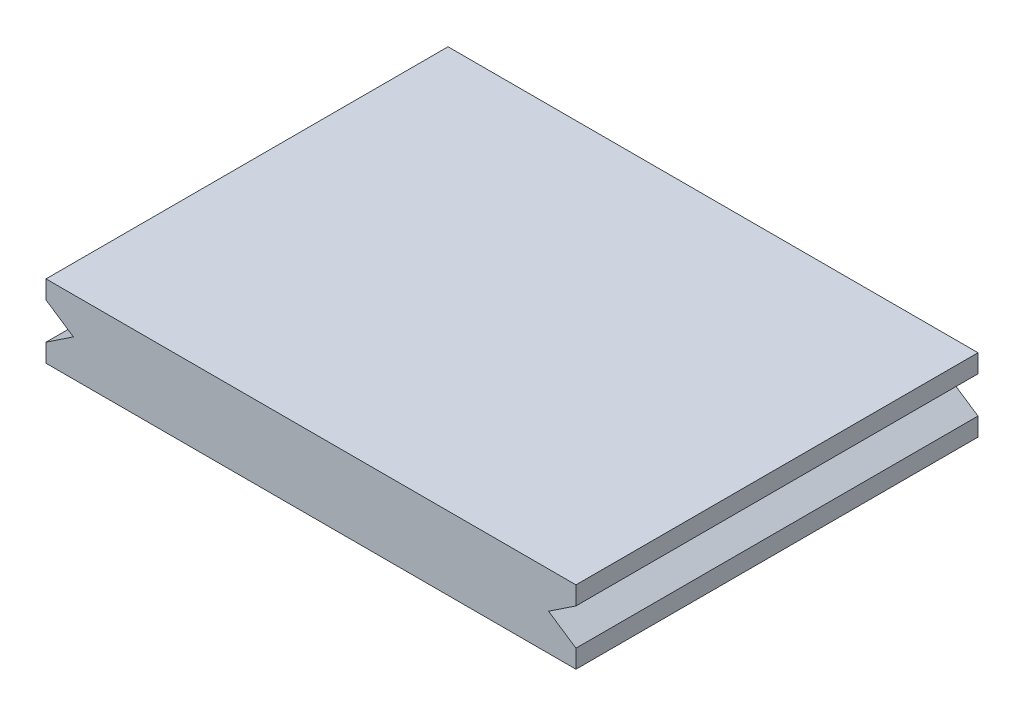
ISO-10303-21;
HEADER;
FILE_DESCRIPTION(('STEP AP214'),'2;1');
FILE_NAME('part.step','',(''),(''),'','','');
FILE_SCHEMA(('AUTOMOTIVE_DESIGN { 1 0 10303 214 1 1 1 1 }'));
ENDSEC;
DATA;
#1=APPLICATION_CONTEXT('core data for automotive mechanical design processes');
#2=APPLICATION_PROTOCOL_DEFINITION('international standard','automotive_design',2000,#1);
#3=PRODUCT_CONTEXT('',#1,'mechanical');
#4=PRODUCT('Part','Part','',(#3));
#5=PRODUCT_RELATED_PRODUCT_CATEGORY('part','',(#4));
#6=PRODUCT_DEFINITION_FORMATION('','',#4);
#7=PRODUCT_DEFINITION_CONTEXT('part definition',#1,'design');
#8=PRODUCT_DEFINITION('design','',#6,#7);
#9=PRODUCT_DEFINITION_SHAPE('','',#8);
#10=(LENGTH_UNIT() NAMED_UNIT(*) SI_UNIT(.MILLI.,.METRE.));
#11=(NAMED_UNIT(*) PLANE_ANGLE_UNIT() SI_UNIT($,.RADIAN.));
#12=(NAMED_UNIT(*) SI_UNIT($,.STERADIAN.) SOLID_ANGLE_UNIT());
#13=UNCERTAINTY_MEASURE_WITH_UNIT(LENGTH_MEASURE(1.E-05),#10,'distance_accuracy_value','');
#14=(GEOMETRIC_REPRESENTATION_CONTEXT(3) GLOBAL_UNCERTAINTY_ASSIGNED_CONTEXT((#13)) GLOBAL_UNIT_ASSIGNED_CONTEXT((#10,
#11,#12)) REPRESENTATION_CONTEXT('',''));
#15=CARTESIAN_POINT('',(0.,0.,0.));
#16=DIRECTION('',(0.,0.,1.));
#17=DIRECTION('',(1.,0.,0.));
#18=AXIS2_PLACEMENT_3D('',#15,#16,#17);
#19=CARTESIAN_POINT('',(11.6,0.,17.6));
#20=DIRECTION('',(1.,0.,0.));
#21=DIRECTION('',(0.,0.,-1.));
#22=AXIS2_PLACEMENT_3D('',#19,#20,#21);
#23=PLANE('',#22);
#24=DIRECTION('',(0.,-1.,0.));
#25=VECTOR('',#24,1.);
#26=CARTESIAN_POINT('',(11.6,0.,0.));
#27=LINE('',#26,#25);
#28=CARTESIAN_POINT('',(11.6,-0.799999999999979,0.));
#29=VERTEX_POINT('',#28);
#30=CARTESIAN_POINT('',(11.6,-1.6,0.));
#31=VERTEX_POINT('',#30);
#32=EDGE_CURVE('E139',#29,#31,#27,.T.);
#33=ORIENTED_EDGE('',*,*,#32,.F.);
#34=DIRECTION('',(0.,0.,-1.));
#35=VECTOR('',#34,1.);
#36=CARTESIAN_POINT('',(11.6,-0.799999999999979,17.6));
#37=LINE('',#36,#35);
#38=CARTESIAN_POINT('',(11.6,-0.799999999999979,17.6));
#39=VERTEX_POINT('',#38);
#40=EDGE_CURVE('E11',#39,#29,#37,.T.);
#41=ORIENTED_EDGE('',*,*,#40,.F.);
#42=DIRECTION('',(0.,-1.,0.));
#43=VECTOR('',#42,1.);
#44=CARTESIAN_POINT('',(11.6,0.,17.6));
#45=LINE('',#44,#43);
#46=CARTESIAN_POINT('',(11.6,-1.6,17.6));
#47=VERTEX_POINT('',#46);
#48=EDGE_CURVE('E160',#39,#47,#45,.T.);
#49=ORIENTED_EDGE('',*,*,#48,.T.);
#50=DIRECTION('',(0.,0.,-1.));
#51=VECTOR('',#50,1.);
#52=CARTESIAN_POINT('',(11.6,-1.6,17.6));
#53=LINE('',#52,#51);
#54=EDGE_CURVE('E90',#47,#31,#53,.T.);
#55=ORIENTED_EDGE('',*,*,#54,.T.);
#56=EDGE_LOOP('',(#33,#41,#49,#55));
#57=FACE_BOUND('',#56,.T.);
#58=ADVANCED_FACE('F33',(#57),#23,.T.);
#59=CARTESIAN_POINT('',(3.2,4.80000000000001,17.6));
#60=DIRECTION('',(-0.554700196225228,-0.832050294337844,0.));
#61=DIRECTION('',(0.832050294337844,-0.554700196225228,0.));
#62=AXIS2_PLACEMENT_3D('',#59,#60,#61);
#63=PLANE('',#62);
#64=DIRECTION('',(-0.832050294337844,0.554700196225228,0.));
#65=VECTOR('',#64,1.);
#66=CARTESIAN_POINT('',(3.2,4.80000000000001,0.));
#67=LINE('',#66,#65);
#68=CARTESIAN_POINT('',(10.4,0.,0.));
#69=VERTEX_POINT('',#68);
#70=EDGE_CURVE('E142',#29,#69,#67,.T.);
#71=ORIENTED_EDGE('',*,*,#70,.T.);
#72=DIRECTION('',(0.,0.,-1.));
#73=VECTOR('',#72,1.);
#74=CARTESIAN_POINT('',(10.4,0.,17.6));
#75=LINE('',#74,#73);
#76=CARTESIAN_POINT('',(10.4,0.,17.6));
#77=VERTEX_POINT('',#76);
#78=EDGE_CURVE('E42',#77,#69,#75,.T.);
#79=ORIENTED_EDGE('',*,*,#78,.F.);
#80=DIRECTION('',(-0.832050294337844,0.554700196225228,0.));
#81=VECTOR('',#80,1.);
#82=CARTESIAN_POINT('',(3.2,4.80000000000001,17.6));
#83=LINE('',#82,#81);
#84=EDGE_CURVE('E197',#39,#77,#83,.T.);
#85=ORIENTED_EDGE('',*,*,#84,.F.);
#86=ORIENTED_EDGE('',*,*,#40,.T.);
#87=EDGE_LOOP('',(#71,#79,#85,#86));
#88=FACE_BOUND('',#87,.T.);
#89=ADVANCED_FACE('F35',(#88),#63,.F.);
#90=CARTESIAN_POINT('',(3.20000000000001,-4.79999999999999,17.6));
#91=DIRECTION('',(-0.554700196225231,0.832050294337842,0.));
#92=DIRECTION('',(-0.832050294337842,-0.554700196225231,0.));
#93=AXIS2_PLACEMENT_3D('',#90,#91,#92);
#94=PLANE('',#93);
#95=DIRECTION('',(0.832050294337842,0.554700196225231,0.));
#96=VECTOR('',#95,1.);
#97=CARTESIAN_POINT('',(3.20000000000001,-4.79999999999999,0.));
#98=LINE('',#97,#96);
#99=CARTESIAN_POINT('',(11.6,0.80000000000003,0.));
#100=VERTEX_POINT('',#99);
#101=EDGE_CURVE('E145',#69,#100,#98,.T.);
#102=ORIENTED_EDGE('',*,*,#101,.T.);
#103=DIRECTION('',(0.,0.,-1.));
#104=VECTOR('',#103,1.);
#105=CARTESIAN_POINT('',(11.6,0.80000000000003,17.6));
#106=LINE('',#105,#104);
#107=CARTESIAN_POINT('',(11.6,0.80000000000003,17.6));
#108=VERTEX_POINT('',#107);
#109=EDGE_CURVE('E170',#108,#100,#106,.T.);
#110=ORIENTED_EDGE('',*,*,#109,.F.);
#111=DIRECTION('',(0.832050294337842,0.554700196225231,0.));
#112=VECTOR('',#111,1.);
#113=CARTESIAN_POINT('',(3.20000000000001,-4.79999999999999,17.6));
#114=LINE('',#113,#112);
#115=EDGE_CURVE('E179',#77,#108,#114,.T.);
#116=ORIENTED_EDGE('',*,*,#115,.F.);
#117=ORIENTED_EDGE('',*,*,#78,.T.);
#118=EDGE_LOOP('',(#102,#110,#116,#117));
#119=FACE_BOUND('',#118,.T.);
#120=ADVANCED_FACE('F176',(#119),#94,.F.);
#121=CARTESIAN_POINT('',(11.6,1.6,0.));
#122=VERTEX_POINT('',#121);
#123=EDGE_CURVE('E143',#122,#100,#27,.T.);
#124=ORIENTED_EDGE('',*,*,#123,.F.);
#125=DIRECTION('',(0.,0.,-1.));
#126=VECTOR('',#125,1.);
#127=CARTESIAN_POINT('',(11.6,1.6,17.6));
#128=LINE('',#127,#126);
#129=CARTESIAN_POINT('',(11.6,1.6,17.6));
#130=VERTEX_POINT('',#129);
#131=EDGE_CURVE('E168',#130,#122,#128,.T.);
#132=ORIENTED_EDGE('',*,*,#131,.F.);
#133=EDGE_CURVE('E191',#130,#108,#45,.T.);
#134=ORIENTED_EDGE('',*,*,#133,.T.);
#135=ORIENTED_EDGE('',*,*,#109,.T.);
#136=EDGE_LOOP('',(#124,#132,#134,#135));
#137=FACE_BOUND('',#136,.T.);
#138=ADVANCED_FACE('F188',(#137),#23,.T.);
#139=CARTESIAN_POINT('',(0.,1.6,17.6));
#140=DIRECTION('',(0.,1.,0.));
#141=DIRECTION('',(0.,0.,1.));
#142=AXIS2_PLACEMENT_3D('',#139,#140,#141);
#143=PLANE('',#142);
#144=DIRECTION('',(1.,0.,0.));
#145=VECTOR('',#144,1.);
#146=CARTESIAN_POINT('',(0.,1.6,0.));
#147=LINE('',#146,#145);
#148=CARTESIAN_POINT('',(-11.6,1.6,0.));
#149=VERTEX_POINT('',#148);
#150=EDGE_CURVE('E148',#149,#122,#147,.T.);
#151=ORIENTED_EDGE('',*,*,#150,.F.);
#152=DIRECTION('',(0.,0.,-1.));
#153=VECTOR('',#152,1.);
#154=CARTESIAN_POINT('',(-11.6,1.6,17.6));
#155=LINE('',#154,#153);
#156=CARTESIAN_POINT('',(-11.6,1.6,17.6));
#157=VERTEX_POINT('',#156);
#158=EDGE_CURVE('E166',#157,#149,#155,.T.);
#159=ORIENTED_EDGE('',*,*,#158,.F.);
#160=DIRECTION('',(1.,0.,0.));
#161=VECTOR('',#160,1.);
#162=CARTESIAN_POINT('',(0.,1.6,17.6));
#163=LINE('',#162,#161);
#164=EDGE_CURVE('E194',#157,#130,#163,.T.);
#165=ORIENTED_EDGE('',*,*,#164,.T.);
#166=ORIENTED_EDGE('',*,*,#131,.T.);
#167=EDGE_LOOP('',(#151,#159,#165,#166));
#168=FACE_BOUND('',#167,.T.);
#169=ADVANCED_FACE('F226',(#168),#143,.T.);
#170=CARTESIAN_POINT('',(-11.6,0.,17.6));
#171=DIRECTION('',(1.,0.,0.));
#172=DIRECTION('',(0.,0.,-1.));
#173=AXIS2_PLACEMENT_3D('',#170,#171,#172);
#174=PLANE('',#173);
#175=DIRECTION('',(0.,-1.,0.));
#176=VECTOR('',#175,1.);
#177=CARTESIAN_POINT('',(-11.6,0.,0.));
#178=LINE('',#177,#176);
#179=CARTESIAN_POINT('',(-11.6,0.8,0.));
#180=VERTEX_POINT('',#179);
#181=EDGE_CURVE('E151',#149,#180,#178,.T.);
#182=ORIENTED_EDGE('',*,*,#181,.T.);
#183=DIRECTION('',(0.,0.,-1.));
#184=VECTOR('',#183,1.);
#185=CARTESIAN_POINT('',(-11.6,0.8,17.6));
#186=LINE('',#185,#184);
#187=CARTESIAN_POINT('',(-11.6,0.8,17.6));
#188=VERTEX_POINT('',#187);
#189=EDGE_CURVE('E164',#188,#180,#186,.T.);
#190=ORIENTED_EDGE('',*,*,#189,.F.);
#191=DIRECTION('',(0.,-1.,0.));
#192=VECTOR('',#191,1.);
#193=CARTESIAN_POINT('',(-11.6,0.,17.6));
#194=LINE('',#193,#192);
#195=EDGE_CURVE('E130',#157,#188,#194,.T.);
#196=ORIENTED_EDGE('',*,*,#195,.F.);
#197=ORIENTED_EDGE('',*,*,#158,.T.);
#198=EDGE_LOOP('',(#182,#190,#196,#197));
#199=FACE_BOUND('',#198,.T.);
#200=ADVANCED_FACE('F203',(#199),#174,.F.);
#201=CARTESIAN_POINT('',(-3.2,-4.8,17.6));
#202=DIRECTION('',(-0.554700196225229,-0.832050294337844,0.));
#203=DIRECTION('',(0.832050294337844,-0.554700196225229,0.));
#204=AXIS2_PLACEMENT_3D('',#201,#202,#203);
#205=PLANE('',#204);
#206=DIRECTION('',(-0.832050294337844,0.554700196225229,0.));
#207=VECTOR('',#206,1.);
#208=CARTESIAN_POINT('',(-3.2,-4.8,0.));
#209=LINE('',#208,#207);
#210=CARTESIAN_POINT('',(-10.4,0.,0.));
#211=VERTEX_POINT('',#210);
#212=EDGE_CURVE('E154',#211,#180,#209,.T.);
#213=ORIENTED_EDGE('',*,*,#212,.F.);
#214=DIRECTION('',(0.,0.,-1.));
#215=VECTOR('',#214,1.);
#216=CARTESIAN_POINT('',(-10.4,0.,17.6));
#217=LINE('',#216,#215);
#218=CARTESIAN_POINT('',(-10.4,0.,17.6));
#219=VERTEX_POINT('',#218);
#220=EDGE_CURVE('E124',#219,#211,#217,.T.);
#221=ORIENTED_EDGE('',*,*,#220,.F.);
#222=DIRECTION('',(-0.832050294337844,0.554700196225229,0.));
#223=VECTOR('',#222,1.);
#224=CARTESIAN_POINT('',(-3.2,-4.8,17.6));
#225=LINE('',#224,#223);
#226=EDGE_CURVE('E134',#219,#188,#225,.T.);
#227=ORIENTED_EDGE('',*,*,#226,.T.);
#228=ORIENTED_EDGE('',*,*,#189,.T.);
#229=EDGE_LOOP('',(#213,#221,#227,#228));
#230=FACE_BOUND('',#229,.T.);
#231=ADVANCED_FACE('F206',(#230),#205,.T.);
#232=CARTESIAN_POINT('',(-3.2,4.8,17.6));
#233=DIRECTION('',(-0.554700196225229,0.832050294337843,0.));
#234=DIRECTION('',(-0.832050294337843,-0.554700196225229,0.));
#235=AXIS2_PLACEMENT_3D('',#232,#233,#234);
#236=PLANE('',#235);
#237=DIRECTION('',(0.832050294337843,0.554700196225229,0.));
#238=VECTOR('',#237,1.);
#239=CARTESIAN_POINT('',(-3.2,4.8,0.));
#240=LINE('',#239,#238);
#241=CARTESIAN_POINT('',(-11.6,-0.800000000000001,0.));
#242=VERTEX_POINT('',#241);
#243=EDGE_CURVE('E123',#242,#211,#240,.T.);
#244=ORIENTED_EDGE('',*,*,#243,.F.);
#245=DIRECTION('',(0.,0.,-1.));
#246=VECTOR('',#245,1.);
#247=CARTESIAN_POINT('',(-11.6,-0.800000000000001,17.6));
#248=LINE('',#247,#246);
#249=CARTESIAN_POINT('',(-11.6,-0.800000000000001,17.6));
#250=VERTEX_POINT('',#249);
#251=EDGE_CURVE('E117',#250,#242,#248,.T.);
#252=ORIENTED_EDGE('',*,*,#251,.F.);
#253=DIRECTION('',(0.832050294337843,0.554700196225229,0.));
#254=VECTOR('',#253,1.);
#255=CARTESIAN_POINT('',(-3.2,4.8,17.6));
#256=LINE('',#255,#254);
#257=EDGE_CURVE('E121',#250,#219,#256,.T.);
#258=ORIENTED_EDGE('',*,*,#257,.T.);
#259=ORIENTED_EDGE('',*,*,#220,.T.);
#260=EDGE_LOOP('',(#244,#252,#258,#259));
#261=FACE_BOUND('',#260,.T.);
#262=ADVANCED_FACE('F119',(#261),#236,.T.);
#263=CARTESIAN_POINT('',(-11.6,-1.6,0.));
#264=VERTEX_POINT('',#263);
#265=EDGE_CURVE('E83',#242,#264,#178,.T.);
#266=ORIENTED_EDGE('',*,*,#265,.T.);
#267=DIRECTION('',(0.,0.,-1.));
#268=VECTOR('',#267,1.);
#269=CARTESIAN_POINT('',(-11.6,-1.6,17.6));
#270=LINE('',#269,#268);
#271=CARTESIAN_POINT('',(-11.6,-1.6,17.6));
#272=VERTEX_POINT('',#271);
#273=EDGE_CURVE('E125',#272,#264,#270,.T.);
#274=ORIENTED_EDGE('',*,*,#273,.F.);
#275=EDGE_CURVE('E127',#250,#272,#194,.T.);
#276=ORIENTED_EDGE('',*,*,#275,.F.);
#277=ORIENTED_EDGE('',*,*,#251,.T.);
#278=EDGE_LOOP('',(#266,#274,#276,#277));
#279=FACE_BOUND('',#278,.T.);
#280=ADVANCED_FACE('F128',(#279),#174,.F.);
#281=CARTESIAN_POINT('',(0.,-1.6,17.6));
#282=DIRECTION('',(0.,1.,0.));
#283=DIRECTION('',(0.,0.,1.));
#284=AXIS2_PLACEMENT_3D('',#281,#282,#283);
#285=PLANE('',#284);
#286=DIRECTION('',(1.,0.,0.));
#287=VECTOR('',#286,1.);
#288=CARTESIAN_POINT('',(0.,-1.6,0.));
#289=LINE('',#288,#287);
#290=EDGE_CURVE('E158',#264,#31,#289,.T.);
#291=ORIENTED_EDGE('',*,*,#290,.T.);
#292=ORIENTED_EDGE('',*,*,#54,.F.);
#293=DIRECTION('',(1.,0.,0.));
#294=VECTOR('',#293,1.);
#295=CARTESIAN_POINT('',(0.,-1.6,17.6));
#296=LINE('',#295,#294);
#297=EDGE_CURVE('E50',#272,#47,#296,.T.);
#298=ORIENTED_EDGE('',*,*,#297,.F.);
#299=ORIENTED_EDGE('',*,*,#273,.T.);
#300=EDGE_LOOP('',(#291,#292,#298,#299));
#301=FACE_BOUND('',#300,.T.);
#302=ADVANCED_FACE('F209',(#301),#285,.F.);
#303=CARTESIAN_POINT('',(0.,0.,17.6));
#304=DIRECTION('',(0.,0.,1.));
#305=DIRECTION('',(1.,0.,0.));
#306=AXIS2_PLACEMENT_3D('',#303,#304,#305);
#307=PLANE('',#306);
#308=ORIENTED_EDGE('',*,*,#48,.F.);
#309=ORIENTED_EDGE('',*,*,#84,.T.);
#310=ORIENTED_EDGE('',*,*,#115,.T.);
#311=ORIENTED_EDGE('',*,*,#133,.F.);
#312=ORIENTED_EDGE('',*,*,#164,.F.);
#313=ORIENTED_EDGE('',*,*,#195,.T.);
#314=ORIENTED_EDGE('',*,*,#226,.F.);
#315=ORIENTED_EDGE('',*,*,#257,.F.);
#316=ORIENTED_EDGE('',*,*,#275,.T.);
#317=ORIENTED_EDGE('',*,*,#297,.T.);
#318=EDGE_LOOP('',(#308,#309,#310,#311,#312,#313,#314,#315,#316,#317));
#319=FACE_BOUND('',#318,.T.);
#320=ADVANCED_FACE('F132',(#319),#307,.T.);
#321=CARTESIAN_POINT('',(0.,0.,0.));
#322=DIRECTION('',(0.,0.,1.));
#323=DIRECTION('',(1.,0.,0.));
#324=AXIS2_PLACEMENT_3D('',#321,#322,#323);
#325=PLANE('',#324);
#326=ORIENTED_EDGE('',*,*,#32,.T.);
#327=ORIENTED_EDGE('',*,*,#290,.F.);
#328=ORIENTED_EDGE('',*,*,#265,.F.);
#329=ORIENTED_EDGE('',*,*,#243,.T.);
#330=ORIENTED_EDGE('',*,*,#212,.T.);
#331=ORIENTED_EDGE('',*,*,#181,.F.);
#332=ORIENTED_EDGE('',*,*,#150,.T.);
#333=ORIENTED_EDGE('',*,*,#123,.T.);
#334=ORIENTED_EDGE('',*,*,#101,.F.);
#335=ORIENTED_EDGE('',*,*,#70,.F.);
#336=EDGE_LOOP('',(#326,#327,#328,#329,#330,#331,#332,#333,#334,#335));
#337=FACE_BOUND('',#336,.T.);
#338=ADVANCED_FACE('F183',(#337),#325,.F.);
#339=CLOSED_SHELL('',(#58,#89,#120,#138,#169,#200,#231,#262,#280,#302,#320,#338));
#340=MANIFOLD_SOLID_BREP('B2',#339);
#341=ADVANCED_BREP_SHAPE_REPRESENTATION('',(#18,#340),#14);
#342=SHAPE_DEFINITION_REPRESENTATION(#9,#341);
ENDSEC;
END-ISO-10303-21;
